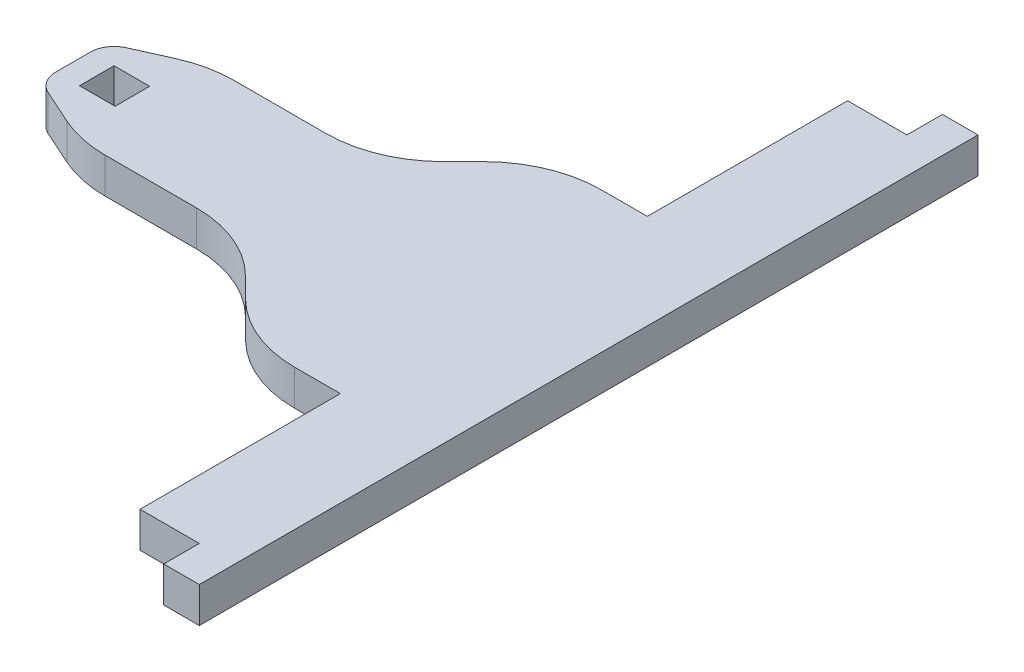
ISO-10303-21;
HEADER;
FILE_DESCRIPTION(('STEP AP214'),'2;1');
FILE_NAME('part.step','',(''),(''),'','','');
FILE_SCHEMA(('AUTOMOTIVE_DESIGN { 1 0 10303 214 1 1 1 1 }'));
ENDSEC;
DATA;
#1=APPLICATION_CONTEXT('core data for automotive mechanical design processes');
#2=APPLICATION_PROTOCOL_DEFINITION('international standard','automotive_design',2000,#1);
#3=PRODUCT_CONTEXT('',#1,'mechanical');
#4=PRODUCT('Part','Part','',(#3));
#5=PRODUCT_RELATED_PRODUCT_CATEGORY('part','',(#4));
#6=PRODUCT_DEFINITION_FORMATION('','',#4);
#7=PRODUCT_DEFINITION_CONTEXT('part definition',#1,'design');
#8=PRODUCT_DEFINITION('design','',#6,#7);
#9=PRODUCT_DEFINITION_SHAPE('','',#8);
#10=(LENGTH_UNIT() NAMED_UNIT(*) SI_UNIT(.MILLI.,.METRE.));
#11=(NAMED_UNIT(*) PLANE_ANGLE_UNIT() SI_UNIT($,.RADIAN.));
#12=(NAMED_UNIT(*) SI_UNIT($,.STERADIAN.) SOLID_ANGLE_UNIT());
#13=UNCERTAINTY_MEASURE_WITH_UNIT(LENGTH_MEASURE(1.E-05),#10,'distance_accuracy_value','');
#14=(GEOMETRIC_REPRESENTATION_CONTEXT(3) GLOBAL_UNCERTAINTY_ASSIGNED_CONTEXT((#13)) GLOBAL_UNIT_ASSIGNED_CONTEXT((#10,
#11,#12)) REPRESENTATION_CONTEXT('',''));
#15=CARTESIAN_POINT('',(0.,0.,0.));
#16=DIRECTION('',(0.,0.,1.));
#17=DIRECTION('',(1.,0.,0.));
#18=AXIS2_PLACEMENT_3D('',#15,#16,#17);
#19=CARTESIAN_POINT('',(-11.8578643762691,3.,35.8));
#20=DIRECTION('',(0.,1.,0.));
#21=DIRECTION('',(0.,0.,1.));
#22=AXIS2_PLACEMENT_3D('',#19,#20,#21);
#23=PLANE('',#22);
#24=DIRECTION('',(0.,0.,-1.));
#25=VECTOR('',#24,1.);
#26=CARTESIAN_POINT('',(0.,3.,0.));
#27=LINE('',#26,#25);
#28=CARTESIAN_POINT('',(0.,3.,65.7));
#29=VERTEX_POINT('',#28);
#30=CARTESIAN_POINT('',(0.,3.,0.));
#31=VERTEX_POINT('',#30);
#32=EDGE_CURVE('E266',#29,#31,#27,.T.);
#33=ORIENTED_EDGE('',*,*,#32,.T.);
#34=DIRECTION('',(-1.,0.,0.));
#35=VECTOR('',#34,1.);
#36=CARTESIAN_POINT('',(0.,3.,0.));
#37=LINE('',#36,#35);
#38=CARTESIAN_POINT('',(-2.99999999999999,3.,0.));
#39=VERTEX_POINT('',#38);
#40=EDGE_CURVE('E269',#31,#39,#37,.T.);
#41=ORIENTED_EDGE('',*,*,#40,.T.);
#42=DIRECTION('',(0.,0.,1.));
#43=VECTOR('',#42,1.);
#44=CARTESIAN_POINT('',(-2.99999999999999,3.,0.));
#45=LINE('',#44,#43);
#46=CARTESIAN_POINT('',(-3.,3.,2.99999999999999));
#47=VERTEX_POINT('',#46);
#48=EDGE_CURVE('E272',#39,#47,#45,.T.);
#49=ORIENTED_EDGE('',*,*,#48,.T.);
#50=DIRECTION('',(-1.,0.,0.));
#51=VECTOR('',#50,1.);
#52=CARTESIAN_POINT('',(-3.,3.,2.99999999999999));
#53=LINE('',#52,#51);
#54=CARTESIAN_POINT('',(-8.,3.,2.99999999999999));
#55=VERTEX_POINT('',#54);
#56=EDGE_CURVE('E274',#47,#55,#53,.T.);
#57=ORIENTED_EDGE('',*,*,#56,.T.);
#58=DIRECTION('',(0.,0.,1.));
#59=VECTOR('',#58,1.);
#60=CARTESIAN_POINT('',(-8.,3.,2.99999999999999));
#61=LINE('',#60,#59);
#62=CARTESIAN_POINT('',(-7.99999999999976,3.,19.9));
#63=VERTEX_POINT('',#62);
#64=EDGE_CURVE('E276',#55,#63,#61,.T.);
#65=ORIENTED_EDGE('',*,*,#64,.T.);
#66=DIRECTION('',(-1.,0.,0.));
#67=VECTOR('',#66,1.);
#68=CARTESIAN_POINT('',(-7.99999999999976,3.,19.9));
#69=LINE('',#68,#67);
#70=CARTESIAN_POINT('',(-11.857864376269,3.,19.9));
#71=VERTEX_POINT('',#70);
#72=EDGE_CURVE('E278',#63,#71,#69,.T.);
#73=ORIENTED_EDGE('',*,*,#72,.T.);
#74=CARTESIAN_POINT('',(-11.8578643762691,3.,29.9));
#75=DIRECTION('',(0.,1.,0.));
#76=DIRECTION('',(0.,0.,-1.));
#77=AXIS2_PLACEMENT_3D('',#74,#75,#76);
#78=CIRCLE('',#77,10.);
#79=CARTESIAN_POINT('',(-18.9289321881346,3.,22.8289321881346));
#80=VERTEX_POINT('',#79);
#81=EDGE_CURVE('E280',#71,#80,#78,.T.);
#82=ORIENTED_EDGE('',*,*,#81,.T.);
#83=DIRECTION('',(-0.707106781186547,0.,0.707106781186547));
#84=VECTOR('',#83,1.);
#85=CARTESIAN_POINT('',(-18.9289321881346,3.,22.8289321881346));
#86=LINE('',#85,#84);
#87=CARTESIAN_POINT('',(-20.5710678118655,3.,24.4710678118654));
#88=VERTEX_POINT('',#87);
#89=EDGE_CURVE('E282',#80,#88,#86,.T.);
#90=ORIENTED_EDGE('',*,*,#89,.T.);
#91=CARTESIAN_POINT('',(-27.642135623731,3.,17.4));
#92=DIRECTION('',(0.,-1.,0.));
#93=DIRECTION('',(0.,0.,-1.));
#94=AXIS2_PLACEMENT_3D('',#91,#92,#93);
#95=CIRCLE('',#94,10.);
#96=CARTESIAN_POINT('',(-27.642135623731,3.,27.4));
#97=VERTEX_POINT('',#96);
#98=EDGE_CURVE('E284',#88,#97,#95,.T.);
#99=ORIENTED_EDGE('',*,*,#98,.T.);
#100=DIRECTION('',(-1.,0.,0.));
#101=VECTOR('',#100,1.);
#102=CARTESIAN_POINT('',(-27.642135623731,3.,27.4));
#103=LINE('',#102,#101);
#104=CARTESIAN_POINT('',(-35.3536531117096,3.,27.4));
#105=VERTEX_POINT('',#104);
#106=EDGE_CURVE('E286',#97,#105,#103,.T.);
#107=ORIENTED_EDGE('',*,*,#106,.T.);
#108=CARTESIAN_POINT('',(-35.3536531117097,3.,37.4));
#109=DIRECTION('',(0.,1.,0.));
#110=DIRECTION('',(0.,0.,1.));
#111=AXIS2_PLACEMENT_3D('',#108,#109,#110);
#112=CIRCLE('',#111,10.);
#113=CARTESIAN_POINT('',(-39.4572998849977,3.,28.2807849482489));
#114=VERTEX_POINT('',#113);
#115=EDGE_CURVE('E288',#105,#114,#112,.T.);
#116=ORIENTED_EDGE('',*,*,#115,.T.);
#117=DIRECTION('',(-0.911921505175106,0.,0.410364677328799));
#118=VECTOR('',#117,1.);
#119=CARTESIAN_POINT('',(-39.4572998849977,3.,28.2807849482489));
#120=LINE('',#119,#118);
#121=CARTESIAN_POINT('',(-42.3207293546576,3.,29.5693282095959));
#122=VERTEX_POINT('',#121);
#123=EDGE_CURVE('E290',#114,#122,#120,.T.);
#124=ORIENTED_EDGE('',*,*,#123,.T.);
#125=CARTESIAN_POINT('',(-41.5,3.,31.3931712199461));
#126=DIRECTION('',(0.,1.,0.));
#127=DIRECTION('',(0.,0.,-1.));
#128=AXIS2_PLACEMENT_3D('',#125,#126,#127);
#129=CIRCLE('',#128,2.);
#130=CARTESIAN_POINT('',(-43.5,3.,31.3931712199461));
#131=VERTEX_POINT('',#130);
#132=EDGE_CURVE('E292',#122,#131,#129,.T.);
#133=ORIENTED_EDGE('',*,*,#132,.T.);
#134=DIRECTION('',(0.,0.,1.));
#135=VECTOR('',#134,1.);
#136=CARTESIAN_POINT('',(-43.5,3.,34.3068287800539));
#137=LINE('',#136,#135);
#138=CARTESIAN_POINT('',(-43.5,3.,34.3068287800539));
#139=VERTEX_POINT('',#138);
#140=EDGE_CURVE('E294',#131,#139,#137,.T.);
#141=ORIENTED_EDGE('',*,*,#140,.T.);
#142=CARTESIAN_POINT('',(-41.5,3.,34.3068287800539));
#143=DIRECTION('',(0.,1.,0.));
#144=DIRECTION('',(0.,0.,1.));
#145=AXIS2_PLACEMENT_3D('',#142,#143,#144);
#146=CIRCLE('',#145,2.);
#147=CARTESIAN_POINT('',(-42.3207293546576,3.,36.1306717904041));
#148=VERTEX_POINT('',#147);
#149=EDGE_CURVE('E296',#139,#148,#146,.T.);
#150=ORIENTED_EDGE('',*,*,#149,.T.);
#151=DIRECTION('',(0.911921505175107,0.,0.410364677328798));
#152=VECTOR('',#151,1.);
#153=CARTESIAN_POINT('',(-39.4572998849977,3.,37.419215051751));
#154=LINE('',#153,#152);
#155=CARTESIAN_POINT('',(-39.4572998849977,3.,37.419215051751));
#156=VERTEX_POINT('',#155);
#157=EDGE_CURVE('E298',#148,#156,#154,.T.);
#158=ORIENTED_EDGE('',*,*,#157,.T.);
#159=CARTESIAN_POINT('',(-35.3536531117097,3.,28.3));
#160=DIRECTION('',(0.,1.,0.));
#161=DIRECTION('',(0.,0.,-1.));
#162=AXIS2_PLACEMENT_3D('',#159,#160,#161);
#163=CIRCLE('',#162,10.);
#164=CARTESIAN_POINT('',(-35.3536531117096,3.,38.3));
#165=VERTEX_POINT('',#164);
#166=EDGE_CURVE('E300',#156,#165,#163,.T.);
#167=ORIENTED_EDGE('',*,*,#166,.T.);
#168=DIRECTION('',(1.,0.,0.));
#169=VECTOR('',#168,1.);
#170=CARTESIAN_POINT('',(-27.642135623731,3.,38.3));
#171=LINE('',#170,#169);
#172=CARTESIAN_POINT('',(-27.642135623731,3.,38.3));
#173=VERTEX_POINT('',#172);
#174=EDGE_CURVE('E302',#165,#173,#171,.T.);
#175=ORIENTED_EDGE('',*,*,#174,.T.);
#176=CARTESIAN_POINT('',(-27.642135623731,3.,48.3));
#177=DIRECTION('',(0.,-1.,0.));
#178=DIRECTION('',(0.,0.,1.));
#179=AXIS2_PLACEMENT_3D('',#176,#177,#178);
#180=CIRCLE('',#179,10.);
#181=CARTESIAN_POINT('',(-20.5710678118654,3.,41.2289321881346));
#182=VERTEX_POINT('',#181);
#183=EDGE_CURVE('E304',#173,#182,#180,.T.);
#184=ORIENTED_EDGE('',*,*,#183,.T.);
#185=DIRECTION('',(0.707106781186547,0.,0.707106781186548));
#186=VECTOR('',#185,1.);
#187=CARTESIAN_POINT('',(-18.9289321881346,3.,42.8710678118654));
#188=LINE('',#187,#186);
#189=CARTESIAN_POINT('',(-18.9289321881346,3.,42.8710678118654));
#190=VERTEX_POINT('',#189);
#191=EDGE_CURVE('E306',#182,#190,#188,.T.);
#192=ORIENTED_EDGE('',*,*,#191,.T.);
#193=CARTESIAN_POINT('',(-11.8578643762691,3.,35.8));
#194=DIRECTION('',(0.,1.,0.));
#195=DIRECTION('',(0.,0.,1.));
#196=AXIS2_PLACEMENT_3D('',#193,#194,#195);
#197=CIRCLE('',#196,10.);
#198=CARTESIAN_POINT('',(-11.8578643762691,3.,45.8));
#199=VERTEX_POINT('',#198);
#200=EDGE_CURVE('E308',#190,#199,#197,.T.);
#201=ORIENTED_EDGE('',*,*,#200,.T.);
#202=DIRECTION('',(1.,0.,0.));
#203=VECTOR('',#202,1.);
#204=CARTESIAN_POINT('',(-7.99999999999976,3.,45.8));
#205=LINE('',#204,#203);
#206=CARTESIAN_POINT('',(-7.99999999999976,3.,45.8));
#207=VERTEX_POINT('',#206);
#208=EDGE_CURVE('E310',#199,#207,#205,.T.);
#209=ORIENTED_EDGE('',*,*,#208,.T.);
#210=DIRECTION('',(0.,0.,1.));
#211=VECTOR('',#210,1.);
#212=CARTESIAN_POINT('',(-7.99999999999976,3.,62.7));
#213=LINE('',#212,#211);
#214=CARTESIAN_POINT('',(-7.99999999999976,3.,62.7));
#215=VERTEX_POINT('',#214);
#216=EDGE_CURVE('E312',#207,#215,#213,.T.);
#217=ORIENTED_EDGE('',*,*,#216,.T.);
#218=DIRECTION('',(1.,0.,0.));
#219=VECTOR('',#218,1.);
#220=CARTESIAN_POINT('',(-2.99999999999992,3.,62.7));
#221=LINE('',#220,#219);
#222=CARTESIAN_POINT('',(-2.99999999999992,3.,62.7));
#223=VERTEX_POINT('',#222);
#224=EDGE_CURVE('E314',#215,#223,#221,.T.);
#225=ORIENTED_EDGE('',*,*,#224,.T.);
#226=DIRECTION('',(0.,0.,1.));
#227=VECTOR('',#226,1.);
#228=CARTESIAN_POINT('',(-2.99999999999984,3.,65.7));
#229=LINE('',#228,#227);
#230=CARTESIAN_POINT('',(-2.99999999999984,3.,65.7));
#231=VERTEX_POINT('',#230);
#232=EDGE_CURVE('E316',#223,#231,#229,.T.);
#233=ORIENTED_EDGE('',*,*,#232,.T.);
#234=DIRECTION('',(1.,0.,0.));
#235=VECTOR('',#234,1.);
#236=CARTESIAN_POINT('',(0.,3.,65.7));
#237=LINE('',#236,#235);
#238=EDGE_CURVE('E318',#231,#29,#237,.T.);
#239=ORIENTED_EDGE('',*,*,#238,.T.);
#240=EDGE_LOOP('',(#33,#41,#49,#57,#65,#73,#82,#90,#99,#107,#116,#124,#133,#141,#150,#158,#167,
#175,#184,#192,#201,#209,#217,#225,#233,#239));
#241=FACE_BOUND('',#240,.T.);
#242=DIRECTION('',(0.,0.,-1.));
#243=VECTOR('',#242,1.);
#244=CARTESIAN_POINT('',(-38.5,3.,31.3931712199461));
#245=LINE('',#244,#243);
#246=CARTESIAN_POINT('',(-38.5,3.,34.3068287800539));
#247=VERTEX_POINT('',#246);
#248=CARTESIAN_POINT('',(-38.5,3.,31.3931712199461));
#249=VERTEX_POINT('',#248);
#250=EDGE_CURVE('E238',#247,#249,#245,.T.);
#251=ORIENTED_EDGE('',*,*,#250,.F.);
#252=DIRECTION('',(1.,0.,0.));
#253=VECTOR('',#252,1.);
#254=CARTESIAN_POINT('',(-38.5,3.,34.3068287800539));
#255=LINE('',#254,#253);
#256=CARTESIAN_POINT('',(-41.5,3.,34.3068287800539));
#257=VERTEX_POINT('',#256);
#258=EDGE_CURVE('E230',#257,#247,#255,.T.);
#259=ORIENTED_EDGE('',*,*,#258,.F.);
#260=DIRECTION('',(0.,0.,1.));
#261=VECTOR('',#260,1.);
#262=CARTESIAN_POINT('',(-41.5,3.,34.3068287800539));
#263=LINE('',#262,#261);
#264=CARTESIAN_POINT('',(-41.5,3.,31.3931712199461));
#265=VERTEX_POINT('',#264);
#266=EDGE_CURVE('E252',#265,#257,#263,.T.);
#267=ORIENTED_EDGE('',*,*,#266,.F.);
#268=DIRECTION('',(-1.,0.,0.));
#269=VECTOR('',#268,1.);
#270=CARTESIAN_POINT('',(-41.5,3.,31.3931712199461));
#271=LINE('',#270,#269);
#272=EDGE_CURVE('E250',#249,#265,#271,.T.);
#273=ORIENTED_EDGE('',*,*,#272,.F.);
#274=EDGE_LOOP('',(#251,#259,#267,#273));
#275=FACE_BOUND('',#274,.T.);
#276=ADVANCED_FACE('F33',(#241,#275),#23,.T.);
#277=CARTESIAN_POINT('',(-11.8578643762691,0.,35.8));
#278=DIRECTION('',(0.,1.,0.));
#279=DIRECTION('',(0.,0.,1.));
#280=AXIS2_PLACEMENT_3D('',#277,#278,#279);
#281=PLANE('',#280);
#282=DIRECTION('',(0.,0.,-1.));
#283=VECTOR('',#282,1.);
#284=CARTESIAN_POINT('',(0.,0.,0.));
#285=LINE('',#284,#283);
#286=CARTESIAN_POINT('',(0.,0.,65.7));
#287=VERTEX_POINT('',#286);
#288=CARTESIAN_POINT('',(0.,0.,0.));
#289=VERTEX_POINT('',#288);
#290=EDGE_CURVE('E246',#287,#289,#285,.T.);
#291=ORIENTED_EDGE('',*,*,#290,.F.);
#292=DIRECTION('',(1.,0.,0.));
#293=VECTOR('',#292,1.);
#294=CARTESIAN_POINT('',(0.,0.,65.7));
#295=LINE('',#294,#293);
#296=CARTESIAN_POINT('',(-2.99999999999984,0.,65.7));
#297=VERTEX_POINT('',#296);
#298=EDGE_CURVE('E270',#297,#287,#295,.T.);
#299=ORIENTED_EDGE('',*,*,#298,.F.);
#300=DIRECTION('',(0.,0.,1.));
#301=VECTOR('',#300,1.);
#302=CARTESIAN_POINT('',(-2.99999999999984,0.,65.7));
#303=LINE('',#302,#301);
#304=CARTESIAN_POINT('',(-2.99999999999992,0.,62.7));
#305=VERTEX_POINT('',#304);
#306=EDGE_CURVE('E369',#305,#297,#303,.T.);
#307=ORIENTED_EDGE('',*,*,#306,.F.);
#308=DIRECTION('',(1.,0.,0.));
#309=VECTOR('',#308,1.);
#310=CARTESIAN_POINT('',(-2.99999999999992,0.,62.7));
#311=LINE('',#310,#309);
#312=CARTESIAN_POINT('',(-7.99999999999976,0.,62.7));
#313=VERTEX_POINT('',#312);
#314=EDGE_CURVE('E367',#313,#305,#311,.T.);
#315=ORIENTED_EDGE('',*,*,#314,.F.);
#316=DIRECTION('',(0.,0.,1.));
#317=VECTOR('',#316,1.);
#318=CARTESIAN_POINT('',(-7.99999999999976,0.,62.7));
#319=LINE('',#318,#317);
#320=CARTESIAN_POINT('',(-7.99999999999976,0.,45.8));
#321=VERTEX_POINT('',#320);
#322=EDGE_CURVE('E365',#321,#313,#319,.T.);
#323=ORIENTED_EDGE('',*,*,#322,.F.);
#324=DIRECTION('',(1.,0.,0.));
#325=VECTOR('',#324,1.);
#326=CARTESIAN_POINT('',(-7.99999999999976,0.,45.8));
#327=LINE('',#326,#325);
#328=CARTESIAN_POINT('',(-11.8578643762691,0.,45.8));
#329=VERTEX_POINT('',#328);
#330=EDGE_CURVE('E363',#329,#321,#327,.T.);
#331=ORIENTED_EDGE('',*,*,#330,.F.);
#332=CARTESIAN_POINT('',(-11.8578643762691,0.,35.8));
#333=DIRECTION('',(0.,1.,0.));
#334=DIRECTION('',(0.,0.,1.));
#335=AXIS2_PLACEMENT_3D('',#332,#333,#334);
#336=CIRCLE('',#335,10.);
#337=CARTESIAN_POINT('',(-18.9289321881346,0.,42.8710678118654));
#338=VERTEX_POINT('',#337);
#339=EDGE_CURVE('E361',#338,#329,#336,.T.);
#340=ORIENTED_EDGE('',*,*,#339,.F.);
#341=DIRECTION('',(0.707106781186547,0.,0.707106781186548));
#342=VECTOR('',#341,1.);
#343=CARTESIAN_POINT('',(-18.9289321881346,0.,42.8710678118654));
#344=LINE('',#343,#342);
#345=CARTESIAN_POINT('',(-20.5710678118654,0.,41.2289321881346));
#346=VERTEX_POINT('',#345);
#347=EDGE_CURVE('E359',#346,#338,#344,.T.);
#348=ORIENTED_EDGE('',*,*,#347,.F.);
#349=CARTESIAN_POINT('',(-27.642135623731,0.,48.3));
#350=DIRECTION('',(0.,-1.,0.));
#351=DIRECTION('',(0.,0.,1.));
#352=AXIS2_PLACEMENT_3D('',#349,#350,#351);
#353=CIRCLE('',#352,10.);
#354=CARTESIAN_POINT('',(-27.642135623731,0.,38.3));
#355=VERTEX_POINT('',#354);
#356=EDGE_CURVE('E357',#355,#346,#353,.T.);
#357=ORIENTED_EDGE('',*,*,#356,.F.);
#358=DIRECTION('',(1.,0.,0.));
#359=VECTOR('',#358,1.);
#360=CARTESIAN_POINT('',(-27.642135623731,0.,38.3));
#361=LINE('',#360,#359);
#362=CARTESIAN_POINT('',(-35.3536531117096,0.,38.3));
#363=VERTEX_POINT('',#362);
#364=EDGE_CURVE('E355',#363,#355,#361,.T.);
#365=ORIENTED_EDGE('',*,*,#364,.F.);
#366=CARTESIAN_POINT('',(-35.3536531117097,0.,28.3));
#367=DIRECTION('',(0.,1.,0.));
#368=DIRECTION('',(0.,0.,-1.));
#369=AXIS2_PLACEMENT_3D('',#366,#367,#368);
#370=CIRCLE('',#369,10.);
#371=CARTESIAN_POINT('',(-39.4572998849977,0.,37.419215051751));
#372=VERTEX_POINT('',#371);
#373=EDGE_CURVE('E353',#372,#363,#370,.T.);
#374=ORIENTED_EDGE('',*,*,#373,.F.);
#375=DIRECTION('',(0.911921505175107,0.,0.410364677328798));
#376=VECTOR('',#375,1.);
#377=CARTESIAN_POINT('',(-39.4572998849977,0.,37.419215051751));
#378=LINE('',#377,#376);
#379=CARTESIAN_POINT('',(-42.3207293546576,0.,36.1306717904041));
#380=VERTEX_POINT('',#379);
#381=EDGE_CURVE('E351',#380,#372,#378,.T.);
#382=ORIENTED_EDGE('',*,*,#381,.F.);
#383=CARTESIAN_POINT('',(-41.5,0.,34.3068287800539));
#384=DIRECTION('',(0.,1.,0.));
#385=DIRECTION('',(0.,0.,1.));
#386=AXIS2_PLACEMENT_3D('',#383,#384,#385);
#387=CIRCLE('',#386,2.);
#388=CARTESIAN_POINT('',(-43.5,0.,34.3068287800539));
#389=VERTEX_POINT('',#388);
#390=EDGE_CURVE('E349',#389,#380,#387,.T.);
#391=ORIENTED_EDGE('',*,*,#390,.F.);
#392=DIRECTION('',(0.,0.,1.));
#393=VECTOR('',#392,1.);
#394=CARTESIAN_POINT('',(-43.5,0.,34.3068287800539));
#395=LINE('',#394,#393);
#396=CARTESIAN_POINT('',(-43.5,0.,31.3931712199461));
#397=VERTEX_POINT('',#396);
#398=EDGE_CURVE('E347',#397,#389,#395,.T.);
#399=ORIENTED_EDGE('',*,*,#398,.F.);
#400=CARTESIAN_POINT('',(-41.5,0.,31.3931712199461));
#401=DIRECTION('',(0.,1.,0.));
#402=DIRECTION('',(0.,0.,-1.));
#403=AXIS2_PLACEMENT_3D('',#400,#401,#402);
#404=CIRCLE('',#403,2.);
#405=CARTESIAN_POINT('',(-42.3207293546576,0.,29.5693282095959));
#406=VERTEX_POINT('',#405);
#407=EDGE_CURVE('E345',#406,#397,#404,.T.);
#408=ORIENTED_EDGE('',*,*,#407,.F.);
#409=DIRECTION('',(-0.911921505175106,0.,0.410364677328799));
#410=VECTOR('',#409,1.);
#411=CARTESIAN_POINT('',(-39.4572998849977,0.,28.2807849482489));
#412=LINE('',#411,#410);
#413=CARTESIAN_POINT('',(-39.4572998849977,0.,28.2807849482489));
#414=VERTEX_POINT('',#413);
#415=EDGE_CURVE('E343',#414,#406,#412,.T.);
#416=ORIENTED_EDGE('',*,*,#415,.F.);
#417=CARTESIAN_POINT('',(-35.3536531117097,0.,37.4));
#418=DIRECTION('',(0.,1.,0.));
#419=DIRECTION('',(0.,0.,1.));
#420=AXIS2_PLACEMENT_3D('',#417,#418,#419);
#421=CIRCLE('',#420,10.);
#422=CARTESIAN_POINT('',(-35.3536531117096,0.,27.4));
#423=VERTEX_POINT('',#422);
#424=EDGE_CURVE('E341',#423,#414,#421,.T.);
#425=ORIENTED_EDGE('',*,*,#424,.F.);
#426=DIRECTION('',(-1.,0.,0.));
#427=VECTOR('',#426,1.);
#428=CARTESIAN_POINT('',(-27.642135623731,0.,27.4));
#429=LINE('',#428,#427);
#430=CARTESIAN_POINT('',(-27.642135623731,0.,27.4));
#431=VERTEX_POINT('',#430);
#432=EDGE_CURVE('E339',#431,#423,#429,.T.);
#433=ORIENTED_EDGE('',*,*,#432,.F.);
#434=CARTESIAN_POINT('',(-27.642135623731,0.,17.4));
#435=DIRECTION('',(0.,-1.,0.));
#436=DIRECTION('',(0.,0.,-1.));
#437=AXIS2_PLACEMENT_3D('',#434,#435,#436);
#438=CIRCLE('',#437,10.);
#439=CARTESIAN_POINT('',(-20.5710678118655,0.,24.4710678118654));
#440=VERTEX_POINT('',#439);
#441=EDGE_CURVE('E337',#440,#431,#438,.T.);
#442=ORIENTED_EDGE('',*,*,#441,.F.);
#443=DIRECTION('',(-0.707106781186547,0.,0.707106781186547));
#444=VECTOR('',#443,1.);
#445=CARTESIAN_POINT('',(-18.9289321881346,0.,22.8289321881346));
#446=LINE('',#445,#444);
#447=CARTESIAN_POINT('',(-18.9289321881346,0.,22.8289321881346));
#448=VERTEX_POINT('',#447);
#449=EDGE_CURVE('E335',#448,#440,#446,.T.);
#450=ORIENTED_EDGE('',*,*,#449,.F.);
#451=CARTESIAN_POINT('',(-11.8578643762691,0.,29.9));
#452=DIRECTION('',(0.,1.,0.));
#453=DIRECTION('',(0.,0.,-1.));
#454=AXIS2_PLACEMENT_3D('',#451,#452,#453);
#455=CIRCLE('',#454,10.);
#456=CARTESIAN_POINT('',(-11.857864376269,0.,19.9));
#457=VERTEX_POINT('',#456);
#458=EDGE_CURVE('E333',#457,#448,#455,.T.);
#459=ORIENTED_EDGE('',*,*,#458,.F.);
#460=DIRECTION('',(-1.,0.,0.));
#461=VECTOR('',#460,1.);
#462=CARTESIAN_POINT('',(-7.99999999999976,0.,19.9));
#463=LINE('',#462,#461);
#464=CARTESIAN_POINT('',(-7.99999999999976,0.,19.9));
#465=VERTEX_POINT('',#464);
#466=EDGE_CURVE('E331',#465,#457,#463,.T.);
#467=ORIENTED_EDGE('',*,*,#466,.F.);
#468=DIRECTION('',(0.,0.,1.));
#469=VECTOR('',#468,1.);
#470=CARTESIAN_POINT('',(-8.,0.,2.99999999999999));
#471=LINE('',#470,#469);
#472=CARTESIAN_POINT('',(-8.,0.,2.99999999999999));
#473=VERTEX_POINT('',#472);
#474=EDGE_CURVE('E329',#473,#465,#471,.T.);
#475=ORIENTED_EDGE('',*,*,#474,.F.);
#476=DIRECTION('',(-1.,0.,0.));
#477=VECTOR('',#476,1.);
#478=CARTESIAN_POINT('',(-3.,0.,2.99999999999999));
#479=LINE('',#478,#477);
#480=CARTESIAN_POINT('',(-3.,0.,2.99999999999999));
#481=VERTEX_POINT('',#480);
#482=EDGE_CURVE('E327',#481,#473,#479,.T.);
#483=ORIENTED_EDGE('',*,*,#482,.F.);
#484=DIRECTION('',(0.,0.,1.));
#485=VECTOR('',#484,1.);
#486=CARTESIAN_POINT('',(-2.99999999999999,0.,0.));
#487=LINE('',#486,#485);
#488=CARTESIAN_POINT('',(-2.99999999999999,0.,0.));
#489=VERTEX_POINT('',#488);
#490=EDGE_CURVE('E325',#489,#481,#487,.T.);
#491=ORIENTED_EDGE('',*,*,#490,.F.);
#492=DIRECTION('',(-1.,0.,0.));
#493=VECTOR('',#492,1.);
#494=CARTESIAN_POINT('',(0.,0.,0.));
#495=LINE('',#494,#493);
#496=EDGE_CURVE('E323',#289,#489,#495,.T.);
#497=ORIENTED_EDGE('',*,*,#496,.F.);
#498=EDGE_LOOP('',(#291,#299,#307,#315,#323,#331,#340,#348,#357,#365,#374,#382,#391,#399,#408,
#416,#425,#433,#442,#450,#459,#467,#475,#483,#491,#497));
#499=FACE_BOUND('',#498,.T.);
#500=DIRECTION('',(1.,0.,0.));
#501=VECTOR('',#500,1.);
#502=CARTESIAN_POINT('',(-38.5,0.,34.3068287800539));
#503=LINE('',#502,#501);
#504=CARTESIAN_POINT('',(-41.5,0.,34.3068287800539));
#505=VERTEX_POINT('',#504);
#506=CARTESIAN_POINT('',(-38.5,0.,34.3068287800539));
#507=VERTEX_POINT('',#506);
#508=EDGE_CURVE('E56',#505,#507,#503,.T.);
#509=ORIENTED_EDGE('',*,*,#508,.T.);
#510=DIRECTION('',(0.,0.,-1.));
#511=VECTOR('',#510,1.);
#512=CARTESIAN_POINT('',(-38.5,0.,31.3931712199461));
#513=LINE('',#512,#511);
#514=CARTESIAN_POINT('',(-38.5,0.,31.3931712199461));
#515=VERTEX_POINT('',#514);
#516=EDGE_CURVE('E245',#507,#515,#513,.T.);
#517=ORIENTED_EDGE('',*,*,#516,.T.);
#518=DIRECTION('',(-1.,0.,0.));
#519=VECTOR('',#518,1.);
#520=CARTESIAN_POINT('',(-41.5,0.,31.3931712199461));
#521=LINE('',#520,#519);
#522=CARTESIAN_POINT('',(-41.5,0.,31.3931712199461));
#523=VERTEX_POINT('',#522);
#524=EDGE_CURVE('E258',#515,#523,#521,.T.);
#525=ORIENTED_EDGE('',*,*,#524,.T.);
#526=DIRECTION('',(0.,0.,1.));
#527=VECTOR('',#526,1.);
#528=CARTESIAN_POINT('',(-41.5,0.,34.3068287800539));
#529=LINE('',#528,#527);
#530=EDGE_CURVE('E239',#523,#505,#529,.T.);
#531=ORIENTED_EDGE('',*,*,#530,.T.);
#532=EDGE_LOOP('',(#509,#517,#525,#531));
#533=FACE_BOUND('',#532,.T.);
#534=ADVANCED_FACE('F453',(#499,#533),#281,.F.);
#535=CARTESIAN_POINT('',(0.,3.,0.));
#536=DIRECTION('',(-1.,0.,0.));
#537=DIRECTION('',(0.,0.,1.));
#538=AXIS2_PLACEMENT_3D('',#535,#536,#537);
#539=PLANE('',#538);
#540=ORIENTED_EDGE('',*,*,#290,.T.);
#541=DIRECTION('',(0.,-1.,0.));
#542=VECTOR('',#541,1.);
#543=CARTESIAN_POINT('',(0.,3.,0.));
#544=LINE('',#543,#542);
#545=EDGE_CURVE('E11',#31,#289,#544,.T.);
#546=ORIENTED_EDGE('',*,*,#545,.F.);
#547=ORIENTED_EDGE('',*,*,#32,.F.);
#548=DIRECTION('',(0.,-1.,0.));
#549=VECTOR('',#548,1.);
#550=CARTESIAN_POINT('',(0.,3.,65.7));
#551=LINE('',#550,#549);
#552=EDGE_CURVE('E320',#29,#287,#551,.T.);
#553=ORIENTED_EDGE('',*,*,#552,.T.);
#554=EDGE_LOOP('',(#540,#546,#547,#553));
#555=FACE_BOUND('',#554,.T.);
#556=ADVANCED_FACE('F35',(#555),#539,.F.);
#557=CARTESIAN_POINT('',(0.,3.,0.));
#558=DIRECTION('',(0.,0.,1.));
#559=DIRECTION('',(1.,0.,0.));
#560=AXIS2_PLACEMENT_3D('',#557,#558,#559);
#561=PLANE('',#560);
#562=ORIENTED_EDGE('',*,*,#496,.T.);
#563=DIRECTION('',(0.,-1.,0.));
#564=VECTOR('',#563,1.);
#565=CARTESIAN_POINT('',(-2.99999999999999,3.,0.));
#566=LINE('',#565,#564);
#567=EDGE_CURVE('E41',#39,#489,#566,.T.);
#568=ORIENTED_EDGE('',*,*,#567,.F.);
#569=ORIENTED_EDGE('',*,*,#40,.F.);
#570=ORIENTED_EDGE('',*,*,#545,.T.);
#571=EDGE_LOOP('',(#562,#568,#569,#570));
#572=FACE_BOUND('',#571,.T.);
#573=ADVANCED_FACE('F470',(#572),#561,.F.);
#574=CARTESIAN_POINT('',(-2.99999999999999,3.,0.));
#575=DIRECTION('',(1.,0.,0.));
#576=DIRECTION('',(0.,0.,-1.));
#577=AXIS2_PLACEMENT_3D('',#574,#575,#576);
#578=PLANE('',#577);
#579=ORIENTED_EDGE('',*,*,#490,.T.);
#580=DIRECTION('',(0.,-1.,0.));
#581=VECTOR('',#580,1.);
#582=CARTESIAN_POINT('',(-3.,3.,2.99999999999999));
#583=LINE('',#582,#581);
#584=EDGE_CURVE('E440',#47,#481,#583,.T.);
#585=ORIENTED_EDGE('',*,*,#584,.F.);
#586=ORIENTED_EDGE('',*,*,#48,.F.);
#587=ORIENTED_EDGE('',*,*,#567,.T.);
#588=EDGE_LOOP('',(#579,#585,#586,#587));
#589=FACE_BOUND('',#588,.T.);
#590=ADVANCED_FACE('F447',(#589),#578,.F.);
#591=CARTESIAN_POINT('',(-3.,3.,2.99999999999999));
#592=DIRECTION('',(0.,0.,1.));
#593=DIRECTION('',(1.,0.,0.));
#594=AXIS2_PLACEMENT_3D('',#591,#592,#593);
#595=PLANE('',#594);
#596=ORIENTED_EDGE('',*,*,#482,.T.);
#597=DIRECTION('',(0.,-1.,0.));
#598=VECTOR('',#597,1.);
#599=CARTESIAN_POINT('',(-8.,3.,2.99999999999999));
#600=LINE('',#599,#598);
#601=EDGE_CURVE('E437',#55,#473,#600,.T.);
#602=ORIENTED_EDGE('',*,*,#601,.F.);
#603=ORIENTED_EDGE('',*,*,#56,.F.);
#604=ORIENTED_EDGE('',*,*,#584,.T.);
#605=EDGE_LOOP('',(#596,#602,#603,#604));
#606=FACE_BOUND('',#605,.T.);
#607=ADVANCED_FACE('F459',(#606),#595,.F.);
#608=CARTESIAN_POINT('',(-8.,3.,2.99999999999999));
#609=DIRECTION('',(1.,0.,0.));
#610=DIRECTION('',(0.,0.,-1.));
#611=AXIS2_PLACEMENT_3D('',#608,#609,#610);
#612=PLANE('',#611);
#613=ORIENTED_EDGE('',*,*,#474,.T.);
#614=DIRECTION('',(0.,-1.,0.));
#615=VECTOR('',#614,1.);
#616=CARTESIAN_POINT('',(-7.99999999999976,3.,19.9));
#617=LINE('',#616,#615);
#618=EDGE_CURVE('E434',#63,#465,#617,.T.);
#619=ORIENTED_EDGE('',*,*,#618,.F.);
#620=ORIENTED_EDGE('',*,*,#64,.F.);
#621=ORIENTED_EDGE('',*,*,#601,.T.);
#622=EDGE_LOOP('',(#613,#619,#620,#621));
#623=FACE_BOUND('',#622,.T.);
#624=ADVANCED_FACE('F463',(#623),#612,.F.);
#625=CARTESIAN_POINT('',(-7.99999999999976,3.,19.9));
#626=DIRECTION('',(0.,0.,1.));
#627=DIRECTION('',(1.,0.,0.));
#628=AXIS2_PLACEMENT_3D('',#625,#626,#627);
#629=PLANE('',#628);
#630=ORIENTED_EDGE('',*,*,#466,.T.);
#631=DIRECTION('',(0.,-1.,0.));
#632=VECTOR('',#631,1.);
#633=CARTESIAN_POINT('',(-11.857864376269,3.,19.9));
#634=LINE('',#633,#632);
#635=EDGE_CURVE('E431',#71,#457,#634,.T.);
#636=ORIENTED_EDGE('',*,*,#635,.F.);
#637=ORIENTED_EDGE('',*,*,#72,.F.);
#638=ORIENTED_EDGE('',*,*,#618,.T.);
#639=EDGE_LOOP('',(#630,#636,#637,#638));
#640=FACE_BOUND('',#639,.T.);
#641=ADVANCED_FACE('F573',(#640),#629,.F.);
#642=CARTESIAN_POINT('',(-11.8578643762691,3.,29.9));
#643=DIRECTION('',(0.,-1.,0.));
#644=DIRECTION('',(0.,0.,-1.));
#645=AXIS2_PLACEMENT_3D('',#642,#643,#644);
#646=CYLINDRICAL_SURFACE('',#645,10.);
#647=ORIENTED_EDGE('',*,*,#458,.T.);
#648=DIRECTION('',(0.,-1.,0.));
#649=VECTOR('',#648,1.);
#650=CARTESIAN_POINT('',(-18.9289321881346,3.,22.8289321881346));
#651=LINE('',#650,#649);
#652=EDGE_CURVE('E428',#80,#448,#651,.T.);
#653=ORIENTED_EDGE('',*,*,#652,.F.);
#654=ORIENTED_EDGE('',*,*,#81,.F.);
#655=ORIENTED_EDGE('',*,*,#635,.T.);
#656=EDGE_LOOP('',(#647,#653,#654,#655));
#657=FACE_BOUND('',#656,.T.);
#658=ADVANCED_FACE('F571',(#657),#646,.T.);
#659=CARTESIAN_POINT('',(-18.9289321881346,3.,22.8289321881346));
#660=DIRECTION('',(0.707106781186548,0.,0.707106781186548));
#661=DIRECTION('',(0.707106781186548,0.,-0.707106781186548));
#662=AXIS2_PLACEMENT_3D('',#659,#660,#661);
#663=PLANE('',#662);
#664=ORIENTED_EDGE('',*,*,#449,.T.);
#665=DIRECTION('',(0.,-1.,0.));
#666=VECTOR('',#665,1.);
#667=CARTESIAN_POINT('',(-20.5710678118655,3.,24.4710678118654));
#668=LINE('',#667,#666);
#669=EDGE_CURVE('E425',#88,#440,#668,.T.);
#670=ORIENTED_EDGE('',*,*,#669,.F.);
#671=ORIENTED_EDGE('',*,*,#89,.F.);
#672=ORIENTED_EDGE('',*,*,#652,.T.);
#673=EDGE_LOOP('',(#664,#670,#671,#672));
#674=FACE_BOUND('',#673,.T.);
#675=ADVANCED_FACE('F566',(#674),#663,.F.);
#676=CARTESIAN_POINT('',(-27.642135623731,3.,17.4));
#677=DIRECTION('',(0.,-1.,0.));
#678=DIRECTION('',(0.,0.,-1.));
#679=AXIS2_PLACEMENT_3D('',#676,#677,#678);
#680=CYLINDRICAL_SURFACE('',#679,10.);
#681=ORIENTED_EDGE('',*,*,#441,.T.);
#682=DIRECTION('',(0.,-1.,0.));
#683=VECTOR('',#682,1.);
#684=CARTESIAN_POINT('',(-27.642135623731,3.,27.4));
#685=LINE('',#684,#683);
#686=EDGE_CURVE('E422',#97,#431,#685,.T.);
#687=ORIENTED_EDGE('',*,*,#686,.F.);
#688=ORIENTED_EDGE('',*,*,#98,.F.);
#689=ORIENTED_EDGE('',*,*,#669,.T.);
#690=EDGE_LOOP('',(#681,#687,#688,#689));
#691=FACE_BOUND('',#690,.T.);
#692=ADVANCED_FACE('F561',(#691),#680,.F.);
#693=CARTESIAN_POINT('',(-27.642135623731,3.,27.4));
#694=DIRECTION('',(0.,0.,1.));
#695=DIRECTION('',(1.,0.,0.));
#696=AXIS2_PLACEMENT_3D('',#693,#694,#695);
#697=PLANE('',#696);
#698=ORIENTED_EDGE('',*,*,#432,.T.);
#699=DIRECTION('',(0.,-1.,0.));
#700=VECTOR('',#699,1.);
#701=CARTESIAN_POINT('',(-35.3536531117096,3.,27.4));
#702=LINE('',#701,#700);
#703=EDGE_CURVE('E419',#105,#423,#702,.T.);
#704=ORIENTED_EDGE('',*,*,#703,.F.);
#705=ORIENTED_EDGE('',*,*,#106,.F.);
#706=ORIENTED_EDGE('',*,*,#686,.T.);
#707=EDGE_LOOP('',(#698,#704,#705,#706));
#708=FACE_BOUND('',#707,.T.);
#709=ADVANCED_FACE('F557',(#708),#697,.F.);
#710=CARTESIAN_POINT('',(-35.3536531117097,3.,37.4));
#711=DIRECTION('',(0.,-1.,0.));
#712=DIRECTION('',(0.,0.,-1.));
#713=AXIS2_PLACEMENT_3D('',#710,#711,#712);
#714=CYLINDRICAL_SURFACE('',#713,10.);
#715=ORIENTED_EDGE('',*,*,#424,.T.);
#716=DIRECTION('',(0.,-1.,0.));
#717=VECTOR('',#716,1.);
#718=CARTESIAN_POINT('',(-39.4572998849977,3.,28.2807849482489));
#719=LINE('',#718,#717);
#720=EDGE_CURVE('E416',#114,#414,#719,.T.);
#721=ORIENTED_EDGE('',*,*,#720,.F.);
#722=ORIENTED_EDGE('',*,*,#115,.F.);
#723=ORIENTED_EDGE('',*,*,#703,.T.);
#724=EDGE_LOOP('',(#715,#721,#722,#723));
#725=FACE_BOUND('',#724,.T.);
#726=ADVANCED_FACE('F552',(#725),#714,.T.);
#727=CARTESIAN_POINT('',(-39.4572998849977,3.,28.2807849482489));
#728=DIRECTION('',(0.410364677328799,0.,0.911921505175106));
#729=DIRECTION('',(0.911921505175106,0.,-0.410364677328799));
#730=AXIS2_PLACEMENT_3D('',#727,#728,#729);
#731=PLANE('',#730);
#732=ORIENTED_EDGE('',*,*,#415,.T.);
#733=DIRECTION('',(0.,-1.,0.));
#734=VECTOR('',#733,1.);
#735=CARTESIAN_POINT('',(-42.3207293546576,3.,29.5693282095959));
#736=LINE('',#735,#734);
#737=EDGE_CURVE('E413',#122,#406,#736,.T.);
#738=ORIENTED_EDGE('',*,*,#737,.F.);
#739=ORIENTED_EDGE('',*,*,#123,.F.);
#740=ORIENTED_EDGE('',*,*,#720,.T.);
#741=EDGE_LOOP('',(#732,#738,#739,#740));
#742=FACE_BOUND('',#741,.T.);
#743=ADVANCED_FACE('F546',(#742),#731,.F.);
#744=CARTESIAN_POINT('',(-41.5,3.,31.3931712199461));
#745=DIRECTION('',(0.,-1.,0.));
#746=DIRECTION('',(0.,0.,-1.));
#747=AXIS2_PLACEMENT_3D('',#744,#745,#746);
#748=CYLINDRICAL_SURFACE('',#747,2.);
#749=ORIENTED_EDGE('',*,*,#407,.T.);
#750=DIRECTION('',(0.,-1.,0.));
#751=VECTOR('',#750,1.);
#752=CARTESIAN_POINT('',(-43.5,3.,31.3931712199461));
#753=LINE('',#752,#751);
#754=EDGE_CURVE('E410',#131,#397,#753,.T.);
#755=ORIENTED_EDGE('',*,*,#754,.F.);
#756=ORIENTED_EDGE('',*,*,#132,.F.);
#757=ORIENTED_EDGE('',*,*,#737,.T.);
#758=EDGE_LOOP('',(#749,#755,#756,#757));
#759=FACE_BOUND('',#758,.T.);
#760=ADVANCED_FACE('F542',(#759),#748,.T.);
#761=CARTESIAN_POINT('',(-43.5,3.,34.3068287800539));
#762=DIRECTION('',(1.,0.,0.));
#763=DIRECTION('',(0.,0.,-1.));
#764=AXIS2_PLACEMENT_3D('',#761,#762,#763);
#765=PLANE('',#764);
#766=ORIENTED_EDGE('',*,*,#398,.T.);
#767=DIRECTION('',(0.,-1.,0.));
#768=VECTOR('',#767,1.);
#769=CARTESIAN_POINT('',(-43.5,3.,34.3068287800539));
#770=LINE('',#769,#768);
#771=EDGE_CURVE('E407',#139,#389,#770,.T.);
#772=ORIENTED_EDGE('',*,*,#771,.F.);
#773=ORIENTED_EDGE('',*,*,#140,.F.);
#774=ORIENTED_EDGE('',*,*,#754,.T.);
#775=EDGE_LOOP('',(#766,#772,#773,#774));
#776=FACE_BOUND('',#775,.T.);
#777=ADVANCED_FACE('F537',(#776),#765,.F.);
#778=CARTESIAN_POINT('',(-41.5,3.,34.3068287800539));
#779=DIRECTION('',(0.,-1.,0.));
#780=DIRECTION('',(0.,0.,-1.));
#781=AXIS2_PLACEMENT_3D('',#778,#779,#780);
#782=CYLINDRICAL_SURFACE('',#781,2.);
#783=ORIENTED_EDGE('',*,*,#390,.T.);
#784=DIRECTION('',(0.,-1.,0.));
#785=VECTOR('',#784,1.);
#786=CARTESIAN_POINT('',(-42.3207293546576,3.,36.1306717904041));
#787=LINE('',#786,#785);
#788=EDGE_CURVE('E404',#148,#380,#787,.T.);
#789=ORIENTED_EDGE('',*,*,#788,.F.);
#790=ORIENTED_EDGE('',*,*,#149,.F.);
#791=ORIENTED_EDGE('',*,*,#771,.T.);
#792=EDGE_LOOP('',(#783,#789,#790,#791));
#793=FACE_BOUND('',#792,.T.);
#794=ADVANCED_FACE('F531',(#793),#782,.T.);
#795=CARTESIAN_POINT('',(-39.4572998849977,3.,37.419215051751));
#796=DIRECTION('',(0.410364677328798,0.,-0.911921505175107));
#797=DIRECTION('',(-0.911921505175107,0.,-0.410364677328798));
#798=AXIS2_PLACEMENT_3D('',#795,#796,#797);
#799=PLANE('',#798);
#800=ORIENTED_EDGE('',*,*,#381,.T.);
#801=DIRECTION('',(0.,-1.,0.));
#802=VECTOR('',#801,1.);
#803=CARTESIAN_POINT('',(-39.4572998849977,3.,37.419215051751));
#804=LINE('',#803,#802);
#805=EDGE_CURVE('E401',#156,#372,#804,.T.);
#806=ORIENTED_EDGE('',*,*,#805,.F.);
#807=ORIENTED_EDGE('',*,*,#157,.F.);
#808=ORIENTED_EDGE('',*,*,#788,.T.);
#809=EDGE_LOOP('',(#800,#806,#807,#808));
#810=FACE_BOUND('',#809,.T.);
#811=ADVANCED_FACE('F527',(#810),#799,.F.);
#812=CARTESIAN_POINT('',(-35.3536531117097,3.,28.3));
#813=DIRECTION('',(0.,-1.,0.));
#814=DIRECTION('',(0.,0.,-1.));
#815=AXIS2_PLACEMENT_3D('',#812,#813,#814);
#816=CYLINDRICAL_SURFACE('',#815,10.);
#817=ORIENTED_EDGE('',*,*,#373,.T.);
#818=DIRECTION('',(0.,-1.,0.));
#819=VECTOR('',#818,1.);
#820=CARTESIAN_POINT('',(-35.3536531117096,3.,38.3));
#821=LINE('',#820,#819);
#822=EDGE_CURVE('E398',#165,#363,#821,.T.);
#823=ORIENTED_EDGE('',*,*,#822,.F.);
#824=ORIENTED_EDGE('',*,*,#166,.F.);
#825=ORIENTED_EDGE('',*,*,#805,.T.);
#826=EDGE_LOOP('',(#817,#823,#824,#825));
#827=FACE_BOUND('',#826,.T.);
#828=ADVANCED_FACE('F522',(#827),#816,.T.);
#829=CARTESIAN_POINT('',(-27.642135623731,3.,38.3));
#830=DIRECTION('',(0.,0.,-1.));
#831=DIRECTION('',(-1.,0.,0.));
#832=AXIS2_PLACEMENT_3D('',#829,#830,#831);
#833=PLANE('',#832);
#834=ORIENTED_EDGE('',*,*,#364,.T.);
#835=DIRECTION('',(0.,-1.,0.));
#836=VECTOR('',#835,1.);
#837=CARTESIAN_POINT('',(-27.642135623731,3.,38.3));
#838=LINE('',#837,#836);
#839=EDGE_CURVE('E395',#173,#355,#838,.T.);
#840=ORIENTED_EDGE('',*,*,#839,.F.);
#841=ORIENTED_EDGE('',*,*,#174,.F.);
#842=ORIENTED_EDGE('',*,*,#822,.T.);
#843=EDGE_LOOP('',(#834,#840,#841,#842));
#844=FACE_BOUND('',#843,.T.);
#845=ADVANCED_FACE('F516',(#844),#833,.F.);
#846=CARTESIAN_POINT('',(-27.642135623731,3.,48.3));
#847=DIRECTION('',(0.,-1.,0.));
#848=DIRECTION('',(0.,0.,-1.));
#849=AXIS2_PLACEMENT_3D('',#846,#847,#848);
#850=CYLINDRICAL_SURFACE('',#849,10.);
#851=ORIENTED_EDGE('',*,*,#356,.T.);
#852=DIRECTION('',(0.,-1.,0.));
#853=VECTOR('',#852,1.);
#854=CARTESIAN_POINT('',(-20.5710678118654,3.,41.2289321881346));
#855=LINE('',#854,#853);
#856=EDGE_CURVE('E392',#182,#346,#855,.T.);
#857=ORIENTED_EDGE('',*,*,#856,.F.);
#858=ORIENTED_EDGE('',*,*,#183,.F.);
#859=ORIENTED_EDGE('',*,*,#839,.T.);
#860=EDGE_LOOP('',(#851,#857,#858,#859));
#861=FACE_BOUND('',#860,.T.);
#862=ADVANCED_FACE('F512',(#861),#850,.F.);
#863=CARTESIAN_POINT('',(-18.9289321881346,3.,42.8710678118654));
#864=DIRECTION('',(0.707106781186548,0.,-0.707106781186547));
#865=DIRECTION('',(-0.707106781186547,0.,-0.707106781186548));
#866=AXIS2_PLACEMENT_3D('',#863,#864,#865);
#867=PLANE('',#866);
#868=ORIENTED_EDGE('',*,*,#347,.T.);
#869=DIRECTION('',(0.,-1.,0.));
#870=VECTOR('',#869,1.);
#871=CARTESIAN_POINT('',(-18.9289321881346,3.,42.8710678118654));
#872=LINE('',#871,#870);
#873=EDGE_CURVE('E389',#190,#338,#872,.T.);
#874=ORIENTED_EDGE('',*,*,#873,.F.);
#875=ORIENTED_EDGE('',*,*,#191,.F.);
#876=ORIENTED_EDGE('',*,*,#856,.T.);
#877=EDGE_LOOP('',(#868,#874,#875,#876));
#878=FACE_BOUND('',#877,.T.);
#879=ADVANCED_FACE('F507',(#878),#867,.F.);
#880=CARTESIAN_POINT('',(-11.8578643762691,3.,35.8));
#881=DIRECTION('',(0.,-1.,0.));
#882=DIRECTION('',(0.,0.,-1.));
#883=AXIS2_PLACEMENT_3D('',#880,#881,#882);
#884=CYLINDRICAL_SURFACE('',#883,10.);
#885=ORIENTED_EDGE('',*,*,#339,.T.);
#886=DIRECTION('',(0.,-1.,0.));
#887=VECTOR('',#886,1.);
#888=CARTESIAN_POINT('',(-11.8578643762691,3.,45.8));
#889=LINE('',#888,#887);
#890=EDGE_CURVE('E386',#199,#329,#889,.T.);
#891=ORIENTED_EDGE('',*,*,#890,.F.);
#892=ORIENTED_EDGE('',*,*,#200,.F.);
#893=ORIENTED_EDGE('',*,*,#873,.T.);
#894=EDGE_LOOP('',(#885,#891,#892,#893));
#895=FACE_BOUND('',#894,.T.);
#896=ADVANCED_FACE('F501',(#895),#884,.T.);
#897=CARTESIAN_POINT('',(-7.99999999999976,3.,45.8));
#898=DIRECTION('',(0.,0.,-1.));
#899=DIRECTION('',(-1.,0.,0.));
#900=AXIS2_PLACEMENT_3D('',#897,#898,#899);
#901=PLANE('',#900);
#902=ORIENTED_EDGE('',*,*,#330,.T.);
#903=DIRECTION('',(0.,-1.,0.));
#904=VECTOR('',#903,1.);
#905=CARTESIAN_POINT('',(-7.99999999999976,3.,45.8));
#906=LINE('',#905,#904);
#907=EDGE_CURVE('E383',#207,#321,#906,.T.);
#908=ORIENTED_EDGE('',*,*,#907,.F.);
#909=ORIENTED_EDGE('',*,*,#208,.F.);
#910=ORIENTED_EDGE('',*,*,#890,.T.);
#911=EDGE_LOOP('',(#902,#908,#909,#910));
#912=FACE_BOUND('',#911,.T.);
#913=ADVANCED_FACE('F497',(#912),#901,.F.);
#914=CARTESIAN_POINT('',(-7.99999999999976,3.,62.7));
#915=DIRECTION('',(1.,0.,0.));
#916=DIRECTION('',(0.,0.,-1.));
#917=AXIS2_PLACEMENT_3D('',#914,#915,#916);
#918=PLANE('',#917);
#919=ORIENTED_EDGE('',*,*,#322,.T.);
#920=DIRECTION('',(0.,-1.,0.));
#921=VECTOR('',#920,1.);
#922=CARTESIAN_POINT('',(-7.99999999999976,3.,62.7));
#923=LINE('',#922,#921);
#924=EDGE_CURVE('E380',#215,#313,#923,.T.);
#925=ORIENTED_EDGE('',*,*,#924,.F.);
#926=ORIENTED_EDGE('',*,*,#216,.F.);
#927=ORIENTED_EDGE('',*,*,#907,.T.);
#928=EDGE_LOOP('',(#919,#925,#926,#927));
#929=FACE_BOUND('',#928,.T.);
#930=ADVANCED_FACE('F492',(#929),#918,.F.);
#931=CARTESIAN_POINT('',(-2.99999999999992,3.,62.7));
#932=DIRECTION('',(0.,0.,-1.));
#933=DIRECTION('',(-1.,0.,0.));
#934=AXIS2_PLACEMENT_3D('',#931,#932,#933);
#935=PLANE('',#934);
#936=ORIENTED_EDGE('',*,*,#314,.T.);
#937=DIRECTION('',(0.,-1.,0.));
#938=VECTOR('',#937,1.);
#939=CARTESIAN_POINT('',(-2.99999999999992,3.,62.7));
#940=LINE('',#939,#938);
#941=EDGE_CURVE('E377',#223,#305,#940,.T.);
#942=ORIENTED_EDGE('',*,*,#941,.F.);
#943=ORIENTED_EDGE('',*,*,#224,.F.);
#944=ORIENTED_EDGE('',*,*,#924,.T.);
#945=EDGE_LOOP('',(#936,#942,#943,#944));
#946=FACE_BOUND('',#945,.T.);
#947=ADVANCED_FACE('F486',(#946),#935,.F.);
#948=CARTESIAN_POINT('',(-2.99999999999984,3.,65.7));
#949=DIRECTION('',(1.,0.,0.));
#950=DIRECTION('',(0.,0.,-1.));
#951=AXIS2_PLACEMENT_3D('',#948,#949,#950);
#952=PLANE('',#951);
#953=ORIENTED_EDGE('',*,*,#306,.T.);
#954=DIRECTION('',(0.,-1.,0.));
#955=VECTOR('',#954,1.);
#956=CARTESIAN_POINT('',(-2.99999999999984,3.,65.7));
#957=LINE('',#956,#955);
#958=EDGE_CURVE('E374',#231,#297,#957,.T.);
#959=ORIENTED_EDGE('',*,*,#958,.F.);
#960=ORIENTED_EDGE('',*,*,#232,.F.);
#961=ORIENTED_EDGE('',*,*,#941,.T.);
#962=EDGE_LOOP('',(#953,#959,#960,#961));
#963=FACE_BOUND('',#962,.T.);
#964=ADVANCED_FACE('F482',(#963),#952,.F.);
#965=CARTESIAN_POINT('',(0.,3.,65.7));
#966=DIRECTION('',(0.,0.,-1.));
#967=DIRECTION('',(-1.,0.,0.));
#968=AXIS2_PLACEMENT_3D('',#965,#966,#967);
#969=PLANE('',#968);
#970=ORIENTED_EDGE('',*,*,#298,.T.);
#971=ORIENTED_EDGE('',*,*,#552,.F.);
#972=ORIENTED_EDGE('',*,*,#238,.F.);
#973=ORIENTED_EDGE('',*,*,#958,.T.);
#974=EDGE_LOOP('',(#970,#971,#972,#973));
#975=FACE_BOUND('',#974,.T.);
#976=ADVANCED_FACE('F477',(#975),#969,.F.);
#977=CARTESIAN_POINT('',(-38.5,3.,34.3068287800539));
#978=DIRECTION('',(0.,0.,-1.));
#979=DIRECTION('',(-1.,0.,0.));
#980=AXIS2_PLACEMENT_3D('',#977,#978,#979);
#981=PLANE('',#980);
#982=ORIENTED_EDGE('',*,*,#508,.F.);
#983=DIRECTION('',(0.,-1.,0.));
#984=VECTOR('',#983,1.);
#985=CARTESIAN_POINT('',(-41.5,3.,34.3068287800539));
#986=LINE('',#985,#984);
#987=EDGE_CURVE('E234',#257,#505,#986,.T.);
#988=ORIENTED_EDGE('',*,*,#987,.F.);
#989=ORIENTED_EDGE('',*,*,#258,.T.);
#990=DIRECTION('',(0.,-1.,0.));
#991=VECTOR('',#990,1.);
#992=CARTESIAN_POINT('',(-38.5,3.,34.3068287800539));
#993=LINE('',#992,#991);
#994=EDGE_CURVE('E233',#247,#507,#993,.T.);
#995=ORIENTED_EDGE('',*,*,#994,.T.);
#996=EDGE_LOOP('',(#982,#988,#989,#995));
#997=FACE_BOUND('',#996,.T.);
#998=ADVANCED_FACE('F232',(#997),#981,.T.);
#999=CARTESIAN_POINT('',(-38.5,3.,31.3931712199461));
#1000=DIRECTION('',(-1.,0.,0.));
#1001=DIRECTION('',(0.,0.,1.));
#1002=AXIS2_PLACEMENT_3D('',#999,#1000,#1001);
#1003=PLANE('',#1002);
#1004=ORIENTED_EDGE('',*,*,#516,.F.);
#1005=ORIENTED_EDGE('',*,*,#994,.F.);
#1006=ORIENTED_EDGE('',*,*,#250,.T.);
#1007=DIRECTION('',(0.,-1.,0.));
#1008=VECTOR('',#1007,1.);
#1009=CARTESIAN_POINT('',(-38.5,3.,31.3931712199461));
#1010=LINE('',#1009,#1008);
#1011=EDGE_CURVE('E247',#249,#515,#1010,.T.);
#1012=ORIENTED_EDGE('',*,*,#1011,.T.);
#1013=EDGE_LOOP('',(#1004,#1005,#1006,#1012));
#1014=FACE_BOUND('',#1013,.T.);
#1015=ADVANCED_FACE('F242',(#1014),#1003,.T.);
#1016=CARTESIAN_POINT('',(-41.5,3.,31.3931712199461));
#1017=DIRECTION('',(0.,0.,1.));
#1018=DIRECTION('',(1.,0.,0.));
#1019=AXIS2_PLACEMENT_3D('',#1016,#1017,#1018);
#1020=PLANE('',#1019);
#1021=ORIENTED_EDGE('',*,*,#524,.F.);
#1022=ORIENTED_EDGE('',*,*,#1011,.F.);
#1023=ORIENTED_EDGE('',*,*,#272,.T.);
#1024=DIRECTION('',(0.,-1.,0.));
#1025=VECTOR('',#1024,1.);
#1026=CARTESIAN_POINT('',(-41.5,3.,31.3931712199461));
#1027=LINE('',#1026,#1025);
#1028=EDGE_CURVE('E48',#265,#523,#1027,.T.);
#1029=ORIENTED_EDGE('',*,*,#1028,.T.);
#1030=EDGE_LOOP('',(#1021,#1022,#1023,#1029));
#1031=FACE_BOUND('',#1030,.T.);
#1032=ADVANCED_FACE('F715',(#1031),#1020,.T.);
#1033=CARTESIAN_POINT('',(-41.5,3.,34.3068287800539));
#1034=DIRECTION('',(1.,0.,0.));
#1035=DIRECTION('',(0.,0.,-1.));
#1036=AXIS2_PLACEMENT_3D('',#1033,#1034,#1035);
#1037=PLANE('',#1036);
#1038=ORIENTED_EDGE('',*,*,#530,.F.);
#1039=ORIENTED_EDGE('',*,*,#1028,.F.);
#1040=ORIENTED_EDGE('',*,*,#266,.T.);
#1041=ORIENTED_EDGE('',*,*,#987,.T.);
#1042=EDGE_LOOP('',(#1038,#1039,#1040,#1041));
#1043=FACE_BOUND('',#1042,.T.);
#1044=ADVANCED_FACE('F721',(#1043),#1037,.T.);
#1045=CLOSED_SHELL('',(#276,#534,#556,#573,#590,#607,#624,#641,#658,#675,#692,#709,#726,#743,
#760,#777,#794,#811,#828,#845,#862,#879,#896,#913,#930,#947,#964,#976,#998,#1015,#1032,#1044));
#1046=MANIFOLD_SOLID_BREP('B2',#1045);
#1047=ADVANCED_BREP_SHAPE_REPRESENTATION('',(#18,#1046),#14);
#1048=SHAPE_DEFINITION_REPRESENTATION(#9,#1047);
ENDSEC;
END-ISO-10303-21;
